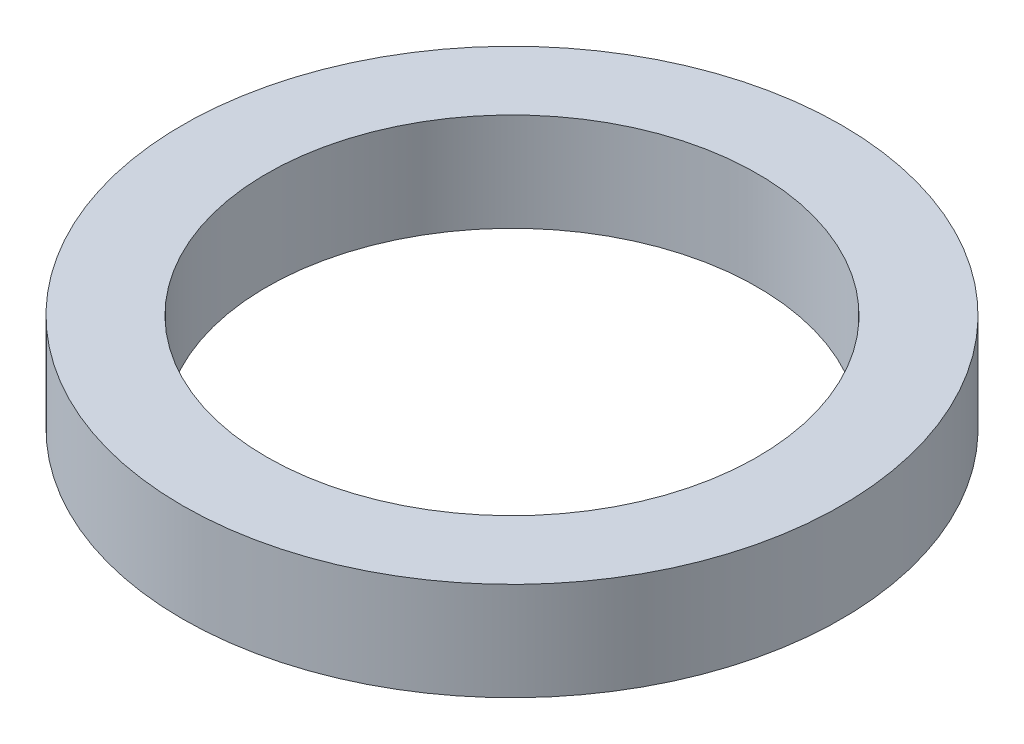
ISO-10303-21;
HEADER;
FILE_DESCRIPTION(('STEP AP214'),'2;1');
FILE_NAME('part.step','',(''),(''),'','','');
FILE_SCHEMA(('AUTOMOTIVE_DESIGN { 1 0 10303 214 1 1 1 1 }'));
ENDSEC;
DATA;
#1=APPLICATION_CONTEXT('core data for automotive mechanical design processes');
#2=APPLICATION_PROTOCOL_DEFINITION('international standard','automotive_design',2000,#1);
#3=PRODUCT_CONTEXT('',#1,'mechanical');
#4=PRODUCT('Part','Part','',(#3));
#5=PRODUCT_RELATED_PRODUCT_CATEGORY('part','',(#4));
#6=PRODUCT_DEFINITION_FORMATION('','',#4);
#7=PRODUCT_DEFINITION_CONTEXT('part definition',#1,'design');
#8=PRODUCT_DEFINITION('design','',#6,#7);
#9=PRODUCT_DEFINITION_SHAPE('','',#8);
#10=(LENGTH_UNIT() NAMED_UNIT(*) SI_UNIT(.MILLI.,.METRE.));
#11=(NAMED_UNIT(*) PLANE_ANGLE_UNIT() SI_UNIT($,.RADIAN.));
#12=(NAMED_UNIT(*) SI_UNIT($,.STERADIAN.) SOLID_ANGLE_UNIT());
#13=UNCERTAINTY_MEASURE_WITH_UNIT(LENGTH_MEASURE(1.E-05),#10,'distance_accuracy_value','');
#14=(GEOMETRIC_REPRESENTATION_CONTEXT(3) GLOBAL_UNCERTAINTY_ASSIGNED_CONTEXT((#13)) GLOBAL_UNIT_ASSIGNED_CONTEXT((#10,
#11,#12)) REPRESENTATION_CONTEXT('',''));
#15=CARTESIAN_POINT('',(0.,0.,0.));
#16=DIRECTION('',(0.,0.,1.));
#17=DIRECTION('',(1.,0.,0.));
#18=AXIS2_PLACEMENT_3D('',#15,#16,#17);
#19=CARTESIAN_POINT('',(0.,7.,0.));
#20=DIRECTION('',(0.,1.,0.));
#21=DIRECTION('',(0.,0.,1.));
#22=AXIS2_PLACEMENT_3D('',#19,#20,#21);
#23=PLANE('',#22);
#24=CARTESIAN_POINT('',(0.,7.,0.));
#25=DIRECTION('',(0.,1.,0.));
#26=DIRECTION('',(0.,0.,1.));
#27=AXIS2_PLACEMENT_3D('',#24,#25,#26);
#28=CIRCLE('',#27,23.5);
#29=CARTESIAN_POINT('',(0.,7.,23.5));
#30=VERTEX_POINT('',#29);
#31=EDGE_CURVE('E10',#30,#30,#28,.T.);
#32=ORIENTED_EDGE('',*,*,#31,.T.);
#33=EDGE_LOOP('',(#32));
#34=FACE_BOUND('',#33,.T.);
#35=CARTESIAN_POINT('',(0.,7.,0.));
#36=DIRECTION('',(0.,1.,0.));
#37=DIRECTION('',(0.,0.,1.));
#38=AXIS2_PLACEMENT_3D('',#35,#36,#37);
#39=CIRCLE('',#38,17.5);
#40=CARTESIAN_POINT('',(0.,7.,17.5));
#41=VERTEX_POINT('',#40);
#42=EDGE_CURVE('E41',#41,#41,#39,.T.);
#43=ORIENTED_EDGE('',*,*,#42,.F.);
#44=EDGE_LOOP('',(#43));
#45=FACE_BOUND('',#44,.T.);
#46=ADVANCED_FACE('F30',(#34,#45),#23,.T.);
#47=CARTESIAN_POINT('',(0.,0.,0.));
#48=DIRECTION('',(0.,1.,0.));
#49=DIRECTION('',(0.,0.,1.));
#50=AXIS2_PLACEMENT_3D('',#47,#48,#49);
#51=PLANE('',#50);
#52=CARTESIAN_POINT('',(0.,0.,0.));
#53=DIRECTION('',(0.,1.,0.));
#54=DIRECTION('',(0.,0.,1.));
#55=AXIS2_PLACEMENT_3D('',#52,#53,#54);
#56=CIRCLE('',#55,23.5);
#57=CARTESIAN_POINT('',(0.,0.,23.5));
#58=VERTEX_POINT('',#57);
#59=EDGE_CURVE('E34',#58,#58,#56,.T.);
#60=ORIENTED_EDGE('',*,*,#59,.F.);
#61=EDGE_LOOP('',(#60));
#62=FACE_BOUND('',#61,.T.);
#63=CARTESIAN_POINT('',(0.,0.,0.));
#64=DIRECTION('',(0.,1.,0.));
#65=DIRECTION('',(0.,0.,1.));
#66=AXIS2_PLACEMENT_3D('',#63,#64,#65);
#67=CIRCLE('',#66,17.5);
#68=CARTESIAN_POINT('',(0.,0.,17.5));
#69=VERTEX_POINT('',#68);
#70=EDGE_CURVE('E43',#69,#69,#67,.T.);
#71=ORIENTED_EDGE('',*,*,#70,.T.);
#72=EDGE_LOOP('',(#71));
#73=FACE_BOUND('',#72,.T.);
#74=ADVANCED_FACE('F53',(#62,#73),#51,.F.);
#75=CARTESIAN_POINT('',(0.,7.,0.));
#76=DIRECTION('',(0.,-1.,0.));
#77=DIRECTION('',(0.,0.,-1.));
#78=AXIS2_PLACEMENT_3D('',#75,#76,#77);
#79=CYLINDRICAL_SURFACE('',#78,23.5);
#80=ORIENTED_EDGE('',*,*,#31,.F.);
#81=EDGE_LOOP('',(#80));
#82=FACE_BOUND('',#81,.T.);
#83=ORIENTED_EDGE('',*,*,#59,.T.);
#84=EDGE_LOOP('',(#83));
#85=FACE_BOUND('',#84,.T.);
#86=ADVANCED_FACE('F32',(#82,#85),#79,.T.);
#87=CARTESIAN_POINT('',(0.,7.,0.));
#88=DIRECTION('',(0.,-1.,0.));
#89=DIRECTION('',(0.,0.,-1.));
#90=AXIS2_PLACEMENT_3D('',#87,#88,#89);
#91=CYLINDRICAL_SURFACE('',#90,17.5);
#92=ORIENTED_EDGE('',*,*,#42,.T.);
#93=EDGE_LOOP('',(#92));
#94=FACE_BOUND('',#93,.T.);
#95=ORIENTED_EDGE('',*,*,#70,.F.);
#96=EDGE_LOOP('',(#95));
#97=FACE_BOUND('',#96,.T.);
#98=ADVANCED_FACE('F49',(#94,#97),#91,.F.);
#99=CLOSED_SHELL('',(#46,#74,#86,#98));
#100=MANIFOLD_SOLID_BREP('B2',#99);
#101=ADVANCED_BREP_SHAPE_REPRESENTATION('',(#18,#100),#14);
#102=SHAPE_DEFINITION_REPRESENTATION(#9,#101);
ENDSEC;
END-ISO-10303-21;
